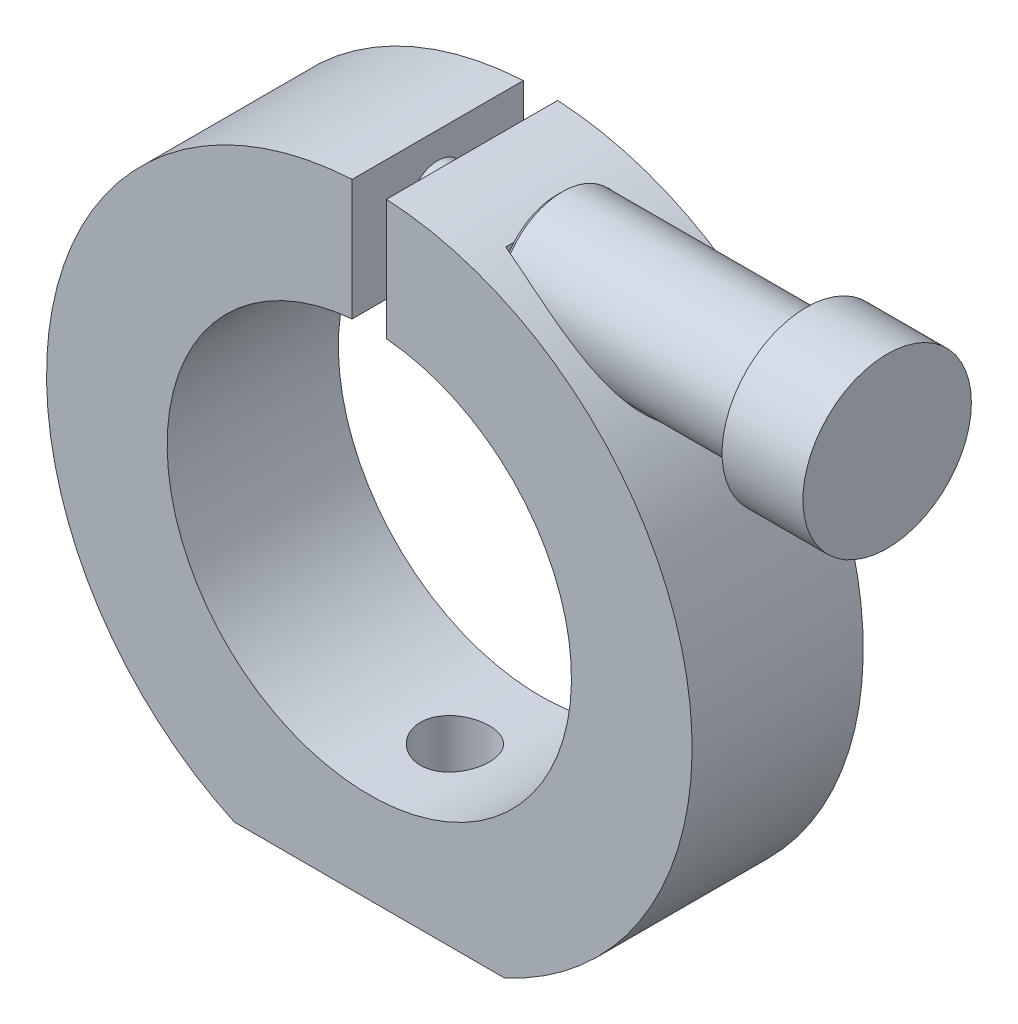
ISO-10303-21;
HEADER;
FILE_DESCRIPTION(('STEP AP214'),'2;1');
FILE_NAME('part.step','',(''),(''),'','','');
FILE_SCHEMA(('AUTOMOTIVE_DESIGN { 1 0 10303 214 1 1 1 1 }'));
ENDSEC;
DATA;
#1=APPLICATION_CONTEXT('core data for automotive mechanical design processes');
#2=APPLICATION_PROTOCOL_DEFINITION('international standard','automotive_design',2000,#1);
#3=PRODUCT_CONTEXT('',#1,'mechanical');
#4=PRODUCT('Part','Part','',(#3));
#5=PRODUCT_RELATED_PRODUCT_CATEGORY('part','',(#4));
#6=PRODUCT_DEFINITION_FORMATION('','',#4);
#7=PRODUCT_DEFINITION_CONTEXT('part definition',#1,'design');
#8=PRODUCT_DEFINITION('design','',#6,#7);
#9=PRODUCT_DEFINITION_SHAPE('','',#8);
#10=(LENGTH_UNIT() NAMED_UNIT(*) SI_UNIT(.MILLI.,.METRE.));
#11=(NAMED_UNIT(*) PLANE_ANGLE_UNIT() SI_UNIT($,.RADIAN.));
#12=(NAMED_UNIT(*) SI_UNIT($,.STERADIAN.) SOLID_ANGLE_UNIT());
#13=UNCERTAINTY_MEASURE_WITH_UNIT(LENGTH_MEASURE(1.E-05),#10,'distance_accuracy_value','');
#14=(GEOMETRIC_REPRESENTATION_CONTEXT(3) GLOBAL_UNCERTAINTY_ASSIGNED_CONTEXT((#13)) GLOBAL_UNIT_ASSIGNED_CONTEXT((#10,
#11,#12)) REPRESENTATION_CONTEXT('',''));
#15=CARTESIAN_POINT('',(0.,0.,0.));
#16=DIRECTION('',(0.,0.,1.));
#17=DIRECTION('',(1.,0.,0.));
#18=AXIS2_PLACEMENT_3D('',#15,#16,#17);
#19=CARTESIAN_POINT('',(12.129998102,29.465143855,-0.0642591750000001));
#20=DIRECTION('',(-1.,0.,0.));
#21=DIRECTION('',(0.,-1.,0.));
#22=AXIS2_PLACEMENT_3D('',#19,#20,#21);
#23=CYLINDRICAL_SURFACE('',#22,2.175);
#24=CARTESIAN_POINT('',(-5.57000189844085,29.465143855,-0.0642591750000001));
#25=DIRECTION('',(-1.,0.,0.));
#26=DIRECTION('',(0.,-1.,0.));
#27=AXIS2_PLACEMENT_3D('',#24,#25,#26);
#28=CIRCLE('',#27,2.175);
#29=CARTESIAN_POINT('',(-5.57000189844085,27.290143855,-0.0642591750000001));
#30=VERTEX_POINT('',#29);
#31=EDGE_CURVE('E135',#30,#30,#28,.T.);
#32=ORIENTED_EDGE('',*,*,#31,.T.);
#33=EDGE_LOOP('',(#32));
#34=FACE_BOUND('',#33,.T.);
#35=CARTESIAN_POINT('',(12.129998101484,29.465143855,-0.0642591750000001));
#36=DIRECTION('',(-1.,0.,0.));
#37=DIRECTION('',(0.,-1.,0.));
#38=AXIS2_PLACEMENT_3D('',#35,#36,#37);
#39=CIRCLE('',#38,2.175);
#40=CARTESIAN_POINT('',(12.129998101484,27.290143855,-0.0642591750000001));
#41=VERTEX_POINT('',#40);
#42=EDGE_CURVE('E138',#41,#41,#39,.F.);
#43=ORIENTED_EDGE('',*,*,#42,.T.);
#44=EDGE_LOOP('',(#43));
#45=FACE_BOUND('',#44,.T.);
#46=ADVANCED_FACE('F18',(#34,#45),#23,.F.);
#47=CARTESIAN_POINT('',(-5.570001898,29.465143855,-0.0642591750000001));
#48=DIRECTION('',(-1.,0.,0.));
#49=DIRECTION('',(0.,0.,1.));
#50=AXIS2_PLACEMENT_3D('',#47,#48,#49);
#51=CONICAL_SURFACE('',#50,2.175,0.785398163397448);
#52=CARTESIAN_POINT('',(-5.97000189800001,29.465143855,-0.0642591750000001));
#53=DIRECTION('',(-1.,0.,0.));
#54=DIRECTION('',(0.,0.,1.));
#55=AXIS2_PLACEMENT_3D('',#52,#53,#54);
#56=CIRCLE('',#55,2.57500000000001);
#57=CARTESIAN_POINT('',(-5.97000189800001,29.465143855,2.51074082500001));
#58=VERTEX_POINT('',#57);
#59=EDGE_CURVE('E141',#58,#58,#56,.T.);
#60=ORIENTED_EDGE('',*,*,#59,.T.);
#61=EDGE_LOOP('',(#60));
#62=FACE_BOUND('',#61,.T.);
#63=ORIENTED_EDGE('',*,*,#31,.F.);
#64=EDGE_LOOP('',(#63));
#65=FACE_BOUND('',#64,.T.);
#66=ADVANCED_FACE('F165',(#62,#65),#51,.F.);
#67=CARTESIAN_POINT('',(12.129998102,29.465143855,-0.0642591750000001));
#68=DIRECTION('',(1.,0.,0.));
#69=DIRECTION('',(0.,1.,0.));
#70=AXIS2_PLACEMENT_3D('',#67,#68,#69);
#71=CONICAL_SURFACE('',#70,2.175,0.785398163397446);
#72=CARTESIAN_POINT('',(12.529998102,29.465143855,-0.0642591750000001));
#73=DIRECTION('',(1.,0.,0.));
#74=DIRECTION('',(0.,1.,0.));
#75=AXIS2_PLACEMENT_3D('',#72,#73,#74);
#76=CIRCLE('',#75,2.57499999999995);
#77=CARTESIAN_POINT('',(12.5299981019999,32.0401438549999,-0.0642591750000001));
#78=VERTEX_POINT('',#77);
#79=EDGE_CURVE('E103',#78,#78,#76,.T.);
#80=ORIENTED_EDGE('',*,*,#79,.T.);
#81=EDGE_LOOP('',(#80));
#82=FACE_BOUND('',#81,.T.);
#83=ORIENTED_EDGE('',*,*,#42,.F.);
#84=EDGE_LOOP('',(#83));
#85=FACE_BOUND('',#84,.T.);
#86=ADVANCED_FACE('F171',(#82,#85),#71,.F.);
#87=CARTESIAN_POINT('',(-12.270001898,29.465143855,-0.0642591750000001));
#88=DIRECTION('',(1.,0.,0.));
#89=DIRECTION('',(0.,0.,-1.));
#90=AXIS2_PLACEMENT_3D('',#87,#88,#89);
#91=CYLINDRICAL_SURFACE('',#90,2.125);
#92=CARTESIAN_POINT('',(-5.97000189851597,29.465143855,-0.0642591750000001));
#93=DIRECTION('',(1.,0.,0.));
#94=DIRECTION('',(0.,0.,-1.));
#95=AXIS2_PLACEMENT_3D('',#92,#93,#94);
#96=CIRCLE('',#95,2.125);
#97=CARTESIAN_POINT('',(-5.97000189851597,29.465143855,-2.189259175));
#98=VERTEX_POINT('',#97);
#99=EDGE_CURVE('E116',#98,#98,#96,.T.);
#100=ORIENTED_EDGE('',*,*,#99,.T.);
#101=EDGE_LOOP('',(#100));
#102=FACE_BOUND('',#101,.T.);
#103=CARTESIAN_POINT('',(-12.270001898516,29.465143855,-0.0642591750000001));
#104=DIRECTION('',(1.,0.,0.));
#105=DIRECTION('',(0.,0.,-1.));
#106=AXIS2_PLACEMENT_3D('',#103,#104,#105);
#107=CIRCLE('',#106,2.125);
#108=CARTESIAN_POINT('',(-12.270001898516,29.465143855,-2.189259175));
#109=VERTEX_POINT('',#108);
#110=EDGE_CURVE('E122',#109,#109,#107,.F.);
#111=ORIENTED_EDGE('',*,*,#110,.T.);
#112=EDGE_LOOP('',(#111));
#113=FACE_BOUND('',#112,.T.);
#114=ADVANCED_FACE('F181',(#102,#113),#91,.F.);
#115=CARTESIAN_POINT('',(-5.970001898,34.165143855,-0.064259175));
#116=DIRECTION('',(-1.,0.,0.));
#117=DIRECTION('',(0.,0.,1.));
#118=AXIS2_PLACEMENT_3D('',#115,#116,#117);
#119=PLANE('',#118);
#120=ORIENTED_EDGE('',*,*,#99,.F.);
#121=EDGE_LOOP('',(#120));
#122=FACE_BOUND('',#121,.T.);
#123=ORIENTED_EDGE('',*,*,#59,.F.);
#124=EDGE_LOOP('',(#123));
#125=FACE_BOUND('',#124,.T.);
#126=ADVANCED_FACE('F212',(#122,#125),#119,.F.);
#127=CARTESIAN_POINT('',(-12.270001898,33.431181884,6.285740825));
#128=DIRECTION('',(1.,0.,0.));
#129=DIRECTION('',(0.,0.,-1.));
#130=AXIS2_PLACEMENT_3D('',#127,#128,#129);
#131=PLANE('',#130);
#132=ORIENTED_EDGE('',*,*,#110,.F.);
#133=EDGE_LOOP('',(#132));
#134=FACE_BOUND('',#133,.T.);
#135=DIRECTION('',(0.,1.,0.));
#136=VECTOR('',#135,1.);
#137=CARTESIAN_POINT('',(-12.270001898,9.515143855,6.285740825));
#138=LINE('',#137,#136);
#139=CARTESIAN_POINT('',(-12.270001898,33.4311818839522,6.285740825));
#140=VERTEX_POINT('',#139);
#141=CARTESIAN_POINT('',(-12.270001898015,24.460858123647,6.285740825));
#142=VERTEX_POINT('',#141);
#143=EDGE_CURVE('E335',#140,#142,#138,.F.);
#144=ORIENTED_EDGE('',*,*,#143,.F.);
#145=DIRECTION('',(0.,0.,-1.));
#146=VECTOR('',#145,1.);
#147=CARTESIAN_POINT('',(-12.270001898,33.431181884,6.285740825));
#148=LINE('',#147,#146);
#149=CARTESIAN_POINT('',(-12.270001898,33.4311818839522,-6.414259175));
#150=VERTEX_POINT('',#149);
#151=EDGE_CURVE('E125',#140,#150,#148,.T.);
#152=ORIENTED_EDGE('',*,*,#151,.T.);
#153=DIRECTION('',(0.,1.,0.));
#154=VECTOR('',#153,1.);
#155=CARTESIAN_POINT('',(-12.270001898,9.515143855,-6.414259175));
#156=LINE('',#155,#154);
#157=CARTESIAN_POINT('',(-12.270001898015,24.460858123647,-6.414259175));
#158=VERTEX_POINT('',#157);
#159=EDGE_CURVE('E338',#158,#150,#156,.T.);
#160=ORIENTED_EDGE('',*,*,#159,.F.);
#161=DIRECTION('',(0.,0.,-1.));
#162=VECTOR('',#161,1.);
#163=CARTESIAN_POINT('',(-12.27000189803,24.4608581236483,6.285740825));
#164=LINE('',#163,#162);
#165=EDGE_CURVE('E230',#142,#158,#164,.T.);
#166=ORIENTED_EDGE('',*,*,#165,.F.);
#167=EDGE_LOOP('',(#144,#152,#160,#166));
#168=FACE_BOUND('',#167,.T.);
#169=ADVANCED_FACE('F208',(#134,#168),#131,.F.);
#170=CARTESIAN_POINT('',(-13.545001898,9.515143855,6.285740825));
#171=DIRECTION('',(0.,0.,-1.));
#172=DIRECTION('',(-1.,0.,0.));
#173=AXIS2_PLACEMENT_3D('',#170,#171,#172);
#174=CYLINDRICAL_SURFACE('',#173,15.);
#175=CARTESIAN_POINT('',(-13.545001898,-5.484856145,2.488440825));
#176=CARTESIAN_POINT('',(-13.6871465246069,-5.4848533762355,2.48843425054818));
#177=CARTESIAN_POINT('',(-13.8294720274502,-5.48281284298392,2.47651767349826));
#178=CARTESIAN_POINT('',(-14.1102357159713,-5.47486375791847,2.42915830945584));
#179=CARTESIAN_POINT('',(-14.2486654373758,-5.46894737409736,2.39366788429897));
#180=CARTESIAN_POINT('',(-14.517375244742,-5.45390999934109,2.30026227037951));
#181=CARTESIAN_POINT('',(-14.6476653713411,-5.44479305224751,2.24237536969335));
#182=CARTESIAN_POINT('',(-14.8966298320807,-5.42435825706781,2.10588669084476));
#183=CARTESIAN_POINT('',(-15.0153084250751,-5.4130412205095,2.02729254699632));
#184=CARTESIAN_POINT('',(-15.2389335856912,-5.38933098896695,1.85077209498865));
#185=CARTESIAN_POINT('',(-15.3437467713865,-5.37692901530232,1.75267795943207));
#186=CARTESIAN_POINT('',(-15.5355156072145,-5.35251310243081,1.54029876651961));
#187=CARTESIAN_POINT('',(-15.6224691804097,-5.3404992084914,1.42601182867225));
#188=CARTESIAN_POINT('',(-15.776573976197,-5.31813661069747,1.18358774324982));
#189=CARTESIAN_POINT('',(-15.8435946295857,-5.30779907985171,1.05536647413837));
#190=CARTESIAN_POINT('',(-15.9550951524479,-5.2900801515601,0.789281526055958));
#191=CARTESIAN_POINT('',(-15.9995768058966,-5.28269852016277,0.651418611210247));
#192=CARTESIAN_POINT('',(-16.0643209420954,-5.27181356369793,0.371362319111017));
#193=CARTESIAN_POINT('',(-16.0848113871749,-5.26827375791088,0.229223087720709));
#194=CARTESIAN_POINT('',(-16.1016983655933,-5.265362951793,-0.0565169482633049));
#195=CARTESIAN_POINT('',(-16.0980966371152,-5.26599165071618,-0.200117646669873));
#196=CARTESIAN_POINT('',(-16.0670871220662,-5.2713135168455,-0.483071605706323));
#197=CARTESIAN_POINT('',(-16.0399361282756,-5.27596283957658,-0.622453953794663));
#198=CARTESIAN_POINT('',(-15.9630016329099,-5.2887334828727,-0.894656854027967));
#199=CARTESIAN_POINT('',(-15.9132171407328,-5.29685495540262,-1.02747711868766));
#200=CARTESIAN_POINT('',(-15.7921681272172,-5.31570223470477,-1.28355435838396));
#201=CARTESIAN_POINT('',(-15.7207967596118,-5.32644094317016,-1.406759837746));
#202=CARTESIAN_POINT('',(-15.5586816307557,-5.34930276552453,-1.6395336549244));
#203=CARTESIAN_POINT('',(-15.4679377293402,-5.36142588942979,-1.74910189406294));
#204=CARTESIAN_POINT('',(-15.2682745194208,-5.38588141755614,-1.95296879791801));
#205=CARTESIAN_POINT('',(-15.1591382727403,-5.39821451962986,-2.04705501706497));
#206=CARTESIAN_POINT('',(-14.9264581924312,-5.42156350794251,-2.21565415086937));
#207=CARTESIAN_POINT('',(-14.8029079602007,-5.4325788047579,-2.29015832463577));
#208=CARTESIAN_POINT('',(-14.5446708390808,-5.45206880433008,-2.41749360793866));
#209=CARTESIAN_POINT('',(-14.4099654130303,-5.46053916540666,-2.47028773588841));
#210=CARTESIAN_POINT('',(-14.1336000727689,-5.47393841309585,-2.55233603002775));
#211=CARTESIAN_POINT('',(-13.9919554871394,-5.47887476008366,-2.58163980059528));
#212=CARTESIAN_POINT('',(-13.7985671698368,-5.48279861831541,-2.60484462081294));
#213=CARTESIAN_POINT('',(-13.747970260778,-5.48356853766727,-2.60938389641412));
#214=CARTESIAN_POINT('',(-13.6465905696808,-5.48459779604648,-2.6154423497752));
#215=CARTESIAN_POINT('',(-13.595807787478,-5.48485713462266,-2.61696152486634));
#216=CARTESIAN_POINT('',(-13.4028572713931,-5.48485337623549,-2.61695260054818));
#217=CARTESIAN_POINT('',(-13.2605317685498,-5.48281284298392,-2.60503602349826));
#218=CARTESIAN_POINT('',(-12.9797680800287,-5.47486375791847,-2.55767665945584));
#219=CARTESIAN_POINT('',(-12.8413383586242,-5.46894737409736,-2.52218623429897));
#220=CARTESIAN_POINT('',(-12.572628551258,-5.45390999934109,-2.42878062037951));
#221=CARTESIAN_POINT('',(-12.4423384246589,-5.44479305224751,-2.37089371969335));
#222=CARTESIAN_POINT('',(-12.1933739639193,-5.42435825706781,-2.23440504084476));
#223=CARTESIAN_POINT('',(-12.0746953709249,-5.4130412205095,-2.15581089699632));
#224=CARTESIAN_POINT('',(-11.8510702103088,-5.38933098896695,-1.97929044498864));
#225=CARTESIAN_POINT('',(-11.7462570246135,-5.37692901530232,-1.88119630943207));
#226=CARTESIAN_POINT('',(-11.5544881887855,-5.35251310243081,-1.66881711651961));
#227=CARTESIAN_POINT('',(-11.4675346155903,-5.3404992084914,-1.55453017867225));
#228=CARTESIAN_POINT('',(-11.313429819803,-5.31813661069747,-1.31210609324982));
#229=CARTESIAN_POINT('',(-11.2464091664143,-5.30779907985171,-1.18388482413836));
#230=CARTESIAN_POINT('',(-11.1349086435521,-5.2900801515601,-0.917799876055955));
#231=CARTESIAN_POINT('',(-11.0904269901034,-5.28269852016277,-0.779936961210244));
#232=CARTESIAN_POINT('',(-11.0256828539046,-5.27181356369793,-0.499880669111013));
#233=CARTESIAN_POINT('',(-11.0051924088251,-5.26827375791088,-0.357741437720705));
#234=CARTESIAN_POINT('',(-10.9883054304067,-5.26536295179301,-0.0720014017366898));
#235=CARTESIAN_POINT('',(-10.9919071588848,-5.26599165071618,0.0715992966698783));
#236=CARTESIAN_POINT('',(-11.0229166739338,-5.2713135168455,0.354553255706329));
#237=CARTESIAN_POINT('',(-11.0500676677244,-5.27596283957658,0.493935603794669));
#238=CARTESIAN_POINT('',(-11.1270021630901,-5.2887334828727,0.766138504027973));
#239=CARTESIAN_POINT('',(-11.1767866552672,-5.29685495540262,0.898958768687665));
#240=CARTESIAN_POINT('',(-11.2978356687828,-5.31570223470478,1.15503600838396));
#241=CARTESIAN_POINT('',(-11.3692070363882,-5.32644094317016,1.27824148774601));
#242=CARTESIAN_POINT('',(-11.5313221652443,-5.34930276552453,1.5110153049244));
#243=CARTESIAN_POINT('',(-11.6220660666598,-5.36142588942979,1.62058354406294));
#244=CARTESIAN_POINT('',(-11.8217292765792,-5.38588141755613,1.82445044791801));
#245=CARTESIAN_POINT('',(-11.9308655232597,-5.39821451962986,1.91853666706498));
#246=CARTESIAN_POINT('',(-12.1635456035688,-5.42156350794251,2.08713580086937));
#247=CARTESIAN_POINT('',(-12.2870958357993,-5.4325788047579,2.16163997463578));
#248=CARTESIAN_POINT('',(-12.5453329569193,-5.45206880433008,2.28897525793867));
#249=CARTESIAN_POINT('',(-12.6800383829697,-5.46053916540666,2.34176938588841));
#250=CARTESIAN_POINT('',(-12.9564037232311,-5.47393841309586,2.42381768002775));
#251=CARTESIAN_POINT('',(-13.0980483088606,-5.47887476008366,2.45312145059528));
#252=CARTESIAN_POINT('',(-13.2914366261632,-5.48279861831541,2.47632627081294));
#253=CARTESIAN_POINT('',(-13.342033535222,-5.48356853766726,2.48086554641412));
#254=CARTESIAN_POINT('',(-13.4434132263192,-5.48459779604648,2.4869239997752));
#255=CARTESIAN_POINT('',(-13.494196008522,-5.48485713462266,2.48844317486633));
#256=CARTESIAN_POINT('',(-13.545001898,-5.484856145,2.488440825));
#257=B_SPLINE_CURVE_WITH_KNOTS('',3,(#175,#176,#177,#178,#179,#180,#181,#182,#183,#184,#185,
#186,#187,#188,#189,#190,#191,#192,#193,#194,#195,#196,#197,#198,#199,#200,#201,#202,#203,#204,
#205,#206,#207,#208,#209,#210,#211,#212,#213,#214,#215,#216,#217,#218,#219,#220,#221,#222,#223,
#224,#225,#226,#227,#228,#229,#230,#231,#232,#233,#234,#235,#236,#237,#238,#239,#240,#241,#242,
#243,#244,#245,#246,#247,#248,#249,#250,#251,#252,#253,#254,#255,#256),.UNSPECIFIED.,.T.,.F.,(4,
2,2,2,2,2,2,2,2,2,2,2,2,2,2,2,2,2,2,2,2,2,2,2,2,2,2,2,2,2,2,2,2,2,2,2,2,2,2,2,4),(0.,
0.4262399222687,0.85334382376056,1.27991001957911,1.70631916917191,2.13657085730245,
2.56687255214526,2.99993378464918,3.43296073474401,3.86183882262125,4.2906859684756,
4.71491472217459,5.13916204491033,5.56554457156986,5.99193018331473,6.42375095602313,
6.85576415564335,7.28851024205021,7.72034007719466,7.87268828593526,8.02503662930084,
8.45127655156954,8.8783804530614,9.30494664887995,9.73135579847275,10.1616074866033,
10.5919091814461,11.02497041395,11.4579973640448,11.8868754519221,12.3157225977764,
12.7399513514754,13.1641986742112,13.5905812008707,14.0169668126156,14.448787585324,
14.8808007849442,15.313546871351,15.7453767064955,15.8977249152361,16.0500732586017),.UNSPECIFIED.);
#258=CARTESIAN_POINT('',(-13.545001898,-5.484856145,2.488440825));
#259=VERTEX_POINT('',#258);
#260=EDGE_CURVE('E313',#259,#259,#257,.T.);
#261=ORIENTED_EDGE('',*,*,#260,.T.);
#262=EDGE_LOOP('',(#261));
#263=FACE_BOUND('',#262,.T.);
#264=CARTESIAN_POINT('',(-13.545001898,9.515143855,-6.414259175));
#265=DIRECTION('',(0.,0.,-1.));
#266=DIRECTION('',(-1.,0.,0.));
#267=AXIS2_PLACEMENT_3D('',#264,#265,#266);
#268=CIRCLE('',#267,15.);
#269=CARTESIAN_POINT('',(-14.820001897985,24.460858123647,-6.414259175));
#270=VERTEX_POINT('',#269);
#271=EDGE_CURVE('E331',#270,#158,#268,.F.);
#272=ORIENTED_EDGE('',*,*,#271,.F.);
#273=DIRECTION('',(0.,0.,-1.));
#274=VECTOR('',#273,1.);
#275=CARTESIAN_POINT('',(-14.82000189797,24.4608581236483,6.285740825));
#276=LINE('',#275,#274);
#277=CARTESIAN_POINT('',(-14.820001897985,24.460858123647,6.285740825));
#278=VERTEX_POINT('',#277);
#279=EDGE_CURVE('E323',#270,#278,#276,.F.);
#280=ORIENTED_EDGE('',*,*,#279,.T.);
#281=CARTESIAN_POINT('',(-13.545001898,9.515143855,6.285740825));
#282=DIRECTION('',(0.,0.,-1.));
#283=DIRECTION('',(-1.,0.,0.));
#284=AXIS2_PLACEMENT_3D('',#281,#282,#283);
#285=CIRCLE('',#284,15.);
#286=EDGE_CURVE('E332',#142,#278,#285,.T.);
#287=ORIENTED_EDGE('',*,*,#286,.F.);
#288=ORIENTED_EDGE('',*,*,#165,.T.);
#289=EDGE_LOOP('',(#272,#280,#287,#288));
#290=FACE_BOUND('',#289,.T.);
#291=ADVANCED_FACE('F211',(#263,#290),#174,.F.);
#292=CARTESIAN_POINT('',(-13.545001898,-5.22421556549061,-0.0642591750000001));
#293=DIRECTION('',(0.,-1.,0.));
#294=DIRECTION('',(0.,0.,-1.));
#295=AXIS2_PLACEMENT_3D('',#292,#293,#294);
#296=CYLINDRICAL_SURFACE('',#295,2.5527);
#297=CARTESIAN_POINT('',(-13.545001898,-12.234856145,-0.0642591750000001));
#298=DIRECTION('',(0.,-1.,0.));
#299=DIRECTION('',(0.,0.,-1.));
#300=AXIS2_PLACEMENT_3D('',#297,#298,#299);
#301=CIRCLE('',#300,2.5527);
#302=CARTESIAN_POINT('',(-13.545001898,-12.234856145,-2.616959175));
#303=VERTEX_POINT('',#302);
#304=EDGE_CURVE('E320',#303,#303,#301,.T.);
#305=ORIENTED_EDGE('',*,*,#304,.T.);
#306=EDGE_LOOP('',(#305));
#307=FACE_BOUND('',#306,.T.);
#308=ORIENTED_EDGE('',*,*,#260,.F.);
#309=EDGE_LOOP('',(#308));
#310=FACE_BOUND('',#309,.T.);
#311=ADVANCED_FACE('F296',(#307,#310),#296,.F.);
#312=CARTESIAN_POINT('',(-13.545001898,9.515143855,-6.414259175));
#313=DIRECTION('',(0.,0.,-1.));
#314=DIRECTION('',(-1.,0.,0.));
#315=AXIS2_PLACEMENT_3D('',#312,#313,#314);
#316=CYLINDRICAL_SURFACE('',#315,23.95);
#317=CARTESIAN_POINT('',(-13.545001898,9.515143855,-6.414259175));
#318=DIRECTION('',(0.,0.,-1.));
#319=DIRECTION('',(-1.,0.,0.));
#320=AXIS2_PLACEMENT_3D('',#317,#318,#319);
#321=CIRCLE('',#320,23.95);
#322=CARTESIAN_POINT('',(-14.820001898,33.4311818839522,-6.414259175));
#323=VERTEX_POINT('',#322);
#324=CARTESIAN_POINT('',(-23.5719655464618,-12.2348561448259,-6.414259175));
#325=VERTEX_POINT('',#324);
#326=EDGE_CURVE('E366',#323,#325,#321,.F.);
#327=ORIENTED_EDGE('',*,*,#326,.T.);
#328=DIRECTION('',(0.,0.,-1.));
#329=VECTOR('',#328,1.);
#330=CARTESIAN_POINT('',(-23.5719655468395,-12.2348561446518,-6.414259175));
#331=LINE('',#330,#329);
#332=CARTESIAN_POINT('',(-23.5719655464618,-12.2348561448259,6.285740825));
#333=VERTEX_POINT('',#332);
#334=EDGE_CURVE('E369',#325,#333,#331,.F.);
#335=ORIENTED_EDGE('',*,*,#334,.T.);
#336=CARTESIAN_POINT('',(-13.545001898,9.515143855,6.285740825));
#337=DIRECTION('',(0.,0.,-1.));
#338=DIRECTION('',(-1.,0.,0.));
#339=AXIS2_PLACEMENT_3D('',#336,#337,#338);
#340=CIRCLE('',#339,23.95);
#341=CARTESIAN_POINT('',(-14.820001898,33.4311818839522,6.285740825));
#342=VERTEX_POINT('',#341);
#343=EDGE_CURVE('E359',#333,#342,#340,.T.);
#344=ORIENTED_EDGE('',*,*,#343,.T.);
#345=DIRECTION('',(0.,0.,1.));
#346=VECTOR('',#345,1.);
#347=CARTESIAN_POINT('',(-14.820001898,33.431181884,6.285740825));
#348=LINE('',#347,#346);
#349=EDGE_CURVE('E371',#323,#342,#348,.T.);
#350=ORIENTED_EDGE('',*,*,#349,.F.);
#351=EDGE_LOOP('',(#327,#335,#344,#350));
#352=FACE_BOUND('',#351,.T.);
#353=ADVANCED_FACE('F292',(#352),#316,.T.);
#354=CARTESIAN_POINT('',(-23.571965547,-12.234856145,6.285740825));
#355=DIRECTION('',(0.,1.,0.));
#356=DIRECTION('',(0.,0.,1.));
#357=AXIS2_PLACEMENT_3D('',#354,#355,#356);
#358=PLANE('',#357);
#359=ORIENTED_EDGE('',*,*,#304,.F.);
#360=EDGE_LOOP('',(#359));
#361=FACE_BOUND('',#360,.T.);
#362=DIRECTION('',(1.,0.,0.));
#363=VECTOR('',#362,1.);
#364=CARTESIAN_POINT('',(-13.545001898,-12.234856145,6.285740825));
#365=LINE('',#364,#363);
#366=CARTESIAN_POINT('',(-3.51803824995057,-12.234856145016,6.285740825));
#367=VERTEX_POINT('',#366);
#368=EDGE_CURVE('E319',#333,#367,#365,.T.);
#369=ORIENTED_EDGE('',*,*,#368,.F.);
#370=ORIENTED_EDGE('',*,*,#334,.F.);
#371=DIRECTION('',(1.,0.,0.));
#372=VECTOR('',#371,1.);
#373=CARTESIAN_POINT('',(-13.545001898,-12.234856145,-6.414259175));
#374=LINE('',#373,#372);
#375=CARTESIAN_POINT('',(-3.51803824995057,-12.234856145016,-6.414259175));
#376=VERTEX_POINT('',#375);
#377=EDGE_CURVE('E362',#376,#325,#374,.F.);
#378=ORIENTED_EDGE('',*,*,#377,.F.);
#379=DIRECTION('',(0.,0.,-1.));
#380=VECTOR('',#379,1.);
#381=CARTESIAN_POINT('',(-3.51803824998526,-12.234856145032,-6.414259175));
#382=LINE('',#381,#380);
#383=EDGE_CURVE('E111',#367,#376,#382,.T.);
#384=ORIENTED_EDGE('',*,*,#383,.F.);
#385=EDGE_LOOP('',(#369,#370,#378,#384));
#386=FACE_BOUND('',#385,.T.);
#387=ADVANCED_FACE('F295',(#361,#386),#358,.F.);
#388=CARTESIAN_POINT('',(-13.545001898,9.515143855,-6.414259175));
#389=DIRECTION('',(0.,0.,1.));
#390=DIRECTION('',(1.,0.,0.));
#391=AXIS2_PLACEMENT_3D('',#388,#389,#390);
#392=PLANE('',#391);
#393=ORIENTED_EDGE('',*,*,#377,.T.);
#394=ORIENTED_EDGE('',*,*,#326,.F.);
#395=DIRECTION('',(0.,1.,0.));
#396=VECTOR('',#395,1.);
#397=CARTESIAN_POINT('',(-14.820001898,9.515143855,-6.414259175));
#398=LINE('',#397,#396);
#399=EDGE_CURVE('E346',#323,#270,#398,.F.);
#400=ORIENTED_EDGE('',*,*,#399,.T.);
#401=ORIENTED_EDGE('',*,*,#271,.T.);
#402=ORIENTED_EDGE('',*,*,#159,.T.);
#403=CARTESIAN_POINT('',(-13.545001898,9.515143855,-6.414259175));
#404=DIRECTION('',(0.,0.,-1.));
#405=DIRECTION('',(-1.,0.,0.));
#406=AXIS2_PLACEMENT_3D('',#403,#404,#405);
#407=CIRCLE('',#406,23.95);
#408=EDGE_CURVE('E341',#150,#376,#407,.T.);
#409=ORIENTED_EDGE('',*,*,#408,.T.);
#410=EDGE_LOOP('',(#393,#394,#400,#401,#402,#409));
#411=FACE_BOUND('',#410,.T.);
#412=ADVANCED_FACE('F300',(#411),#392,.F.);
#413=CARTESIAN_POINT('',(-13.545001898,9.515143855,6.285740825));
#414=DIRECTION('',(0.,0.,1.));
#415=DIRECTION('',(1.,0.,0.));
#416=AXIS2_PLACEMENT_3D('',#413,#414,#415);
#417=PLANE('',#416);
#418=ORIENTED_EDGE('',*,*,#286,.T.);
#419=DIRECTION('',(0.,1.,0.));
#420=VECTOR('',#419,1.);
#421=CARTESIAN_POINT('',(-14.820001898,9.515143855,6.285740825));
#422=LINE('',#421,#420);
#423=EDGE_CURVE('E348',#278,#342,#422,.T.);
#424=ORIENTED_EDGE('',*,*,#423,.T.);
#425=ORIENTED_EDGE('',*,*,#343,.F.);
#426=ORIENTED_EDGE('',*,*,#368,.T.);
#427=CARTESIAN_POINT('',(-13.545001898,9.515143855,6.285740825));
#428=DIRECTION('',(0.,0.,-1.));
#429=DIRECTION('',(-1.,0.,0.));
#430=AXIS2_PLACEMENT_3D('',#427,#428,#429);
#431=CIRCLE('',#430,23.95);
#432=EDGE_CURVE('E355',#367,#140,#431,.F.);
#433=ORIENTED_EDGE('',*,*,#432,.T.);
#434=ORIENTED_EDGE('',*,*,#143,.T.);
#435=EDGE_LOOP('',(#418,#424,#425,#426,#433,#434));
#436=FACE_BOUND('',#435,.T.);
#437=ADVANCED_FACE('F284',(#436),#417,.T.);
#438=CARTESIAN_POINT('',(12.529998102,29.465143855,-0.0642591750000001));
#439=DIRECTION('',(1.,0.,0.));
#440=DIRECTION('',(0.,0.,-1.));
#441=AXIS2_PLACEMENT_3D('',#438,#439,#440);
#442=CYLINDRICAL_SURFACE('',#441,2.);
#443=CARTESIAN_POINT('',(12.529998101484,29.465143855,-0.0642591750000001));
#444=DIRECTION('',(1.,0.,0.));
#445=DIRECTION('',(0.,0.,-1.));
#446=AXIS2_PLACEMENT_3D('',#443,#444,#445);
#447=CIRCLE('',#446,2.);
#448=CARTESIAN_POINT('',(12.529998101484,29.465143855,-2.064259175));
#449=VERTEX_POINT('',#448);
#450=EDGE_CURVE('E377',#449,#449,#447,.F.);
#451=ORIENTED_EDGE('',*,*,#450,.T.);
#452=EDGE_LOOP('',(#451));
#453=FACE_BOUND('',#452,.T.);
#454=CARTESIAN_POINT('',(-14.820001898516,29.465143855,-0.0642591750000001));
#455=DIRECTION('',(1.,0.,0.));
#456=DIRECTION('',(0.,0.,-1.));
#457=AXIS2_PLACEMENT_3D('',#454,#455,#456);
#458=CIRCLE('',#457,2.);
#459=CARTESIAN_POINT('',(-14.820001898516,29.465143855,-2.064259175));
#460=VERTEX_POINT('',#459);
#461=EDGE_CURVE('E374',#460,#460,#458,.T.);
#462=ORIENTED_EDGE('',*,*,#461,.T.);
#463=EDGE_LOOP('',(#462));
#464=FACE_BOUND('',#463,.T.);
#465=ADVANCED_FACE('F280',(#453,#464),#442,.T.);
#466=CARTESIAN_POINT('',(12.529998102,35.715143855,-0.064259175));
#467=DIRECTION('',(-1.,0.,0.));
#468=DIRECTION('',(0.,0.,1.));
#469=AXIS2_PLACEMENT_3D('',#466,#467,#468);
#470=PLANE('',#469);
#471=ORIENTED_EDGE('',*,*,#450,.F.);
#472=EDGE_LOOP('',(#471));
#473=FACE_BOUND('',#472,.T.);
#474=ORIENTED_EDGE('',*,*,#79,.F.);
#475=EDGE_LOOP('',(#474));
#476=FACE_BOUND('',#475,.T.);
#477=ADVANCED_FACE('F283',(#473,#476),#470,.T.);
#478=CARTESIAN_POINT('',(-14.820001898,33.431181884,6.285740825));
#479=DIRECTION('',(-1.,0.,0.));
#480=DIRECTION('',(0.,0.,1.));
#481=AXIS2_PLACEMENT_3D('',#478,#479,#480);
#482=PLANE('',#481);
#483=ORIENTED_EDGE('',*,*,#461,.F.);
#484=EDGE_LOOP('',(#483));
#485=FACE_BOUND('',#484,.T.);
#486=ORIENTED_EDGE('',*,*,#423,.F.);
#487=ORIENTED_EDGE('',*,*,#279,.F.);
#488=ORIENTED_EDGE('',*,*,#399,.F.);
#489=ORIENTED_EDGE('',*,*,#349,.T.);
#490=EDGE_LOOP('',(#486,#487,#488,#489));
#491=FACE_BOUND('',#490,.T.);
#492=ADVANCED_FACE('F163',(#485,#491),#482,.F.);
#493=CARTESIAN_POINT('',(18.529998102,29.465143855,-0.0642591749999998));
#494=DIRECTION('',(1.,0.,0.));
#495=DIRECTION('',(0.,0.,-1.));
#496=AXIS2_PLACEMENT_3D('',#493,#494,#495);
#497=CYLINDRICAL_SURFACE('',#496,6.25);
#498=CARTESIAN_POINT('',(18.529998101484,29.465143855,-0.0642591749999998));
#499=DIRECTION('',(1.,0.,0.));
#500=DIRECTION('',(0.,0.,-1.));
#501=AXIS2_PLACEMENT_3D('',#498,#499,#500);
#502=CIRCLE('',#501,6.25);
#503=CARTESIAN_POINT('',(18.529998101484,29.465143855,-6.314259175));
#504=VERTEX_POINT('',#503);
#505=EDGE_CURVE('E22',#504,#504,#502,.F.);
#506=ORIENTED_EDGE('',*,*,#505,.T.);
#507=EDGE_LOOP('',(#506));
#508=FACE_BOUND('',#507,.T.);
#509=CARTESIAN_POINT('',(12.529998101484,29.465143855,-0.0642591749999998));
#510=DIRECTION('',(1.,0.,0.));
#511=DIRECTION('',(0.,0.,-1.));
#512=AXIS2_PLACEMENT_3D('',#509,#510,#511);
#513=CIRCLE('',#512,6.25);
#514=CARTESIAN_POINT('',(12.529998101484,29.465143855,-6.314259175));
#515=VERTEX_POINT('',#514);
#516=EDGE_CURVE('E104',#515,#515,#513,.F.);
#517=ORIENTED_EDGE('',*,*,#516,.F.);
#518=EDGE_LOOP('',(#517));
#519=FACE_BOUND('',#518,.T.);
#520=ADVANCED_FACE('F151',(#508,#519),#497,.T.);
#521=CARTESIAN_POINT('',(18.529998102,29.465143855,-0.064259175));
#522=DIRECTION('',(1.,0.,0.));
#523=DIRECTION('',(0.,0.,-1.));
#524=AXIS2_PLACEMENT_3D('',#521,#522,#523);
#525=PLANE('',#524);
#526=ORIENTED_EDGE('',*,*,#505,.F.);
#527=EDGE_LOOP('',(#526));
#528=FACE_BOUND('',#527,.T.);
#529=ADVANCED_FACE('F20',(#528),#525,.T.);
#530=CARTESIAN_POINT('',(-5.570001898,29.465143855,-0.0642591749999998));
#531=DIRECTION('',(-1.,0.,0.));
#532=DIRECTION('',(0.,0.,1.));
#533=AXIS2_PLACEMENT_3D('',#530,#531,#532);
#534=CYLINDRICAL_SURFACE('',#533,4.625);
#535=CARTESIAN_POINT('',(-5.57000189851597,29.465143855,-0.0642591749999998));
#536=DIRECTION('',(-1.,0.,0.));
#537=DIRECTION('',(0.,0.,1.));
#538=AXIS2_PLACEMENT_3D('',#535,#536,#537);
#539=CIRCLE('',#538,4.625);
#540=CARTESIAN_POINT('',(-5.57000189851597,29.465143855,4.560740825));
#541=VERTEX_POINT('',#540);
#542=EDGE_CURVE('E128',#541,#541,#539,.F.);
#543=ORIENTED_EDGE('',*,*,#542,.T.);
#544=EDGE_LOOP('',(#543));
#545=FACE_BOUND('',#544,.T.);
#546=CARTESIAN_POINT('',(12.1299981015591,29.465143855,-0.0642591749999998));
#547=DIRECTION('',(-1.,0.,0.));
#548=DIRECTION('',(0.,0.,1.));
#549=AXIS2_PLACEMENT_3D('',#546,#547,#548);
#550=CIRCLE('',#549,4.625);
#551=CARTESIAN_POINT('',(12.1299981015591,29.465143855,4.560740825));
#552=VERTEX_POINT('',#551);
#553=EDGE_CURVE('E100',#552,#552,#550,.T.);
#554=ORIENTED_EDGE('',*,*,#553,.T.);
#555=EDGE_LOOP('',(#554));
#556=FACE_BOUND('',#555,.T.);
#557=ADVANCED_FACE('F155',(#545,#556),#534,.T.);
#558=CARTESIAN_POINT('',(-5.570001898,29.465143855,-0.0642591749999998));
#559=DIRECTION('',(1.,0.,0.));
#560=DIRECTION('',(0.,0.,-1.));
#561=AXIS2_PLACEMENT_3D('',#558,#559,#560);
#562=CONICAL_SURFACE('',#561,4.625,0.785398163397447);
#563=ORIENTED_EDGE('',*,*,#542,.F.);
#564=EDGE_LOOP('',(#563));
#565=FACE_BOUND('',#564,.T.);
#566=CARTESIAN_POINT('',(-5.97000189803254,29.465143855,-0.0642591749999998));
#567=DIRECTION('',(1.,0.,0.));
#568=DIRECTION('',(0.,0.,-1.));
#569=AXIS2_PLACEMENT_3D('',#566,#567,#568);
#570=CIRCLE('',#569,4.22499999996746);
#571=CARTESIAN_POINT('',(-5.97000189801283,32.2356604640999,3.125546887873));
#572=VERTEX_POINT('',#571);
#573=CARTESIAN_POINT('',(-5.97000189801075,32.2356604641713,-3.25406523781372));
#574=VERTEX_POINT('',#573);
#575=EDGE_CURVE('E89',#572,#574,#570,.T.);
#576=ORIENTED_EDGE('',*,*,#575,.T.);
#577=CARTESIAN_POINT('',(-5.9700018980215,29.465143855,-0.0642591749999998));
#578=DIRECTION('',(1.,0.,0.));
#579=DIRECTION('',(0.,0.,-1.));
#580=AXIS2_PLACEMENT_3D('',#577,#578,#579);
#581=CIRCLE('',#580,4.22499999997851);
#582=EDGE_CURVE('E95',#574,#572,#581,.T.);
#583=ORIENTED_EDGE('',*,*,#582,.T.);
#584=EDGE_LOOP('',(#576,#583));
#585=FACE_BOUND('',#584,.T.);
#586=ADVANCED_FACE('F98',(#565,#585),#562,.T.);
#587=CARTESIAN_POINT('',(12.129998102,29.465143855,-0.0642591749999998));
#588=DIRECTION('',(-1.,0.,0.));
#589=DIRECTION('',(0.,-1.,0.));
#590=AXIS2_PLACEMENT_3D('',#587,#588,#589);
#591=CONICAL_SURFACE('',#590,4.625,0.785398163397448);
#592=ORIENTED_EDGE('',*,*,#553,.F.);
#593=EDGE_LOOP('',(#592));
#594=FACE_BOUND('',#593,.T.);
#595=CARTESIAN_POINT('',(12.5299981015217,29.465143855,-0.0642591749999998));
#596=DIRECTION('',(-1.,0.,0.));
#597=DIRECTION('',(0.,-1.,0.));
#598=AXIS2_PLACEMENT_3D('',#595,#596,#597);
#599=CIRCLE('',#598,4.22500000047833);
#600=CARTESIAN_POINT('',(12.5299981015217,25.2401438545217,-0.0642591749999998));
#601=VERTEX_POINT('',#600);
#602=EDGE_CURVE('E96',#601,#601,#599,.T.);
#603=ORIENTED_EDGE('',*,*,#602,.T.);
#604=EDGE_LOOP('',(#603));
#605=FACE_BOUND('',#604,.T.);
#606=ADVANCED_FACE('F176',(#594,#605),#591,.T.);
#607=CARTESIAN_POINT('',(-5.970001898,29.465143855,-0.064259175));
#608=DIRECTION('',(1.,0.,0.));
#609=DIRECTION('',(0.,0.,-1.));
#610=AXIS2_PLACEMENT_3D('',#607,#608,#609);
#611=PLANE('',#610);
#612=ORIENTED_EDGE('',*,*,#582,.F.);
#613=DIRECTION('',(0.,0.,-1.));
#614=VECTOR('',#613,1.);
#615=CARTESIAN_POINT('',(-5.970001898,32.235660464,-0.064259175));
#616=LINE('',#615,#614);
#617=EDGE_CURVE('E82',#574,#572,#616,.F.);
#618=ORIENTED_EDGE('',*,*,#617,.T.);
#619=EDGE_LOOP('',(#612,#618));
#620=FACE_BOUND('',#619,.T.);
#621=ADVANCED_FACE('F102',(#620),#611,.F.);
#622=CARTESIAN_POINT('',(-5.970001898,29.465143855,-0.0642591749999998));
#623=DIRECTION('',(1.,0.,0.));
#624=DIRECTION('',(0.,0.,-1.));
#625=AXIS2_PLACEMENT_3D('',#622,#623,#624);
#626=CYLINDRICAL_SURFACE('',#625,4.7);
#627=CARTESIAN_POINT('',(-5.97000189838234,32.235660464571,3.73234953753426));
#628=CARTESIAN_POINT('',(-5.7283715919769,32.1550948390791,3.79114337560771));
#629=CARTESIAN_POINT('',(-5.48781291657352,32.0706152055507,3.84885860026157));
#630=CARTESIAN_POINT('',(-5.00881386762857,31.8937335202847,3.96102526222642));
#631=CARTESIAN_POINT('',(-4.77037384164034,31.8013301942524,4.01547617216617));
#632=CARTESIAN_POINT('',(-4.05614840350538,31.5112557050054,4.17271990804695));
#633=CARTESIAN_POINT('',(-3.58365946168577,31.3014522583758,4.2688475503505));
#634=CARTESIAN_POINT('',(-2.8741959133395,30.9583003032252,4.39399698649162));
#635=CARTESIAN_POINT('',(-2.63323178005914,30.8367043408085,4.43305912856603));
#636=CARTESIAN_POINT('',(-2.1545740258452,30.5848792307399,4.50227627851128));
#637=CARTESIAN_POINT('',(-1.91687982455387,30.4546516395641,4.53243288692796));
#638=CARTESIAN_POINT('',(-1.44564811744097,30.1859339529483,4.58214787606288));
#639=CARTESIAN_POINT('',(-1.21210370064207,30.0474596812482,4.60172587108498));
#640=CARTESIAN_POINT('',(-0.749388919922272,29.7623317789395,4.62852028902299));
#641=CARTESIAN_POINT('',(-0.520217508587844,29.6156801408194,4.63573970974315));
#642=CARTESIAN_POINT('',(-0.0368842310624658,29.2946326427851,4.63574208870363));
#643=CARTESIAN_POINT('',(0.216558617390389,29.1191374639277,4.62648233401894));
#644=CARTESIAN_POINT('',(0.715492133504564,28.7592449092212,4.58595725248155));
#645=CARTESIAN_POINT('',(0.960979623112975,28.574844047183,4.55468324189363));
#646=CARTESIAN_POINT('',(1.4391726533468,28.2011812739774,4.46661579821698));
#647=CARTESIAN_POINT('',(1.67199079530667,28.0119972314878,4.41011296152498));
#648=CARTESIAN_POINT('',(2.12489198018983,27.6299039119633,4.26741853444903));
#649=CARTESIAN_POINT('',(2.34498922829973,27.4369991240666,4.18126083761867));
#650=CARTESIAN_POINT('',(2.77173286155534,27.0494138219224,3.97345587739305));
#651=CARTESIAN_POINT('',(2.97819304549197,26.8547387473891,3.85140752736557));
#652=CARTESIAN_POINT('',(3.37014713503506,26.4725918682243,3.56771426948637));
#653=CARTESIAN_POINT('',(3.55563749441755,26.2851212854779,3.40606267889394));
#654=CARTESIAN_POINT('',(3.87326954296812,25.9544452748154,3.06813281355634));
#655=CARTESIAN_POINT('',(4.00923157288929,25.8088552461254,2.89787392477831));
#656=CARTESIAN_POINT('',(4.195275117035,25.6053146617691,2.61994227287111));
#657=CARTESIAN_POINT('',(4.2543032873605,25.5399454571715,2.52354782116645));
#658=CARTESIAN_POINT('',(4.36590287428296,25.4151117083911,2.32344362891321));
#659=CARTESIAN_POINT('',(4.41847547836878,25.3556460786439,2.21973523929151));
#660=CARTESIAN_POINT('',(4.50893832870283,25.2524148389869,2.02220344625688));
#661=CARTESIAN_POINT('',(4.54783945802139,25.207647443139,1.9293638895831));
#662=CARTESIAN_POINT('',(4.62032717990627,25.123679814892,1.73920600634375));
#663=CARTESIAN_POINT('',(4.6539146856726,25.0844786260028,1.64188845308634));
#664=CARTESIAN_POINT('',(4.71548464861374,25.0122205845215,1.44326932014768));
#665=CARTESIAN_POINT('',(4.74346694985293,24.9791639028702,1.34196762972232));
#666=CARTESIAN_POINT('',(4.79355332123202,24.9197342065643,1.13604464272651));
#667=CARTESIAN_POINT('',(4.81565973857393,24.8933585232924,1.03142469043139));
#668=CARTESIAN_POINT('',(4.8538746112562,24.8476171526488,0.819083124645422));
#669=CARTESIAN_POINT('',(4.86995610161149,24.8282829906065,0.711349837938518));
#670=CARTESIAN_POINT('',(4.89581031420938,24.7971383536352,0.494096548520554));
#671=CARTESIAN_POINT('',(4.90558566672765,24.7853247419291,0.384577310294016));
#672=CARTESIAN_POINT('',(4.91873465960425,24.7694232350686,0.164587683879367));
#673=CARTESIAN_POINT('',(4.92210781475452,24.7653359254734,0.0541172242376375));
#674=CARTESIAN_POINT('',(4.92241411601613,24.7649650524062,-0.16684202753062));
#675=CARTESIAN_POINT('',(4.9193476143204,24.768681062161,-0.277330818324132));
#676=CARTESIAN_POINT('',(4.90725168578706,24.7833106764937,-0.489642496669413));
#677=CARTESIAN_POINT('',(4.8986578788832,24.7936983902775,-0.591527181668634));
#678=CARTESIAN_POINT('',(4.87601324767237,24.8209929081,-0.793837816698455));
#679=CARTESIAN_POINT('',(4.86196065224232,24.837901827954,-0.894263282298175));
#680=CARTESIAN_POINT('',(4.82852969829028,24.8779728972493,-1.09290870745359));
#681=CARTESIAN_POINT('',(4.8091537791481,24.9011321824142,-1.19112965496978));
#682=CARTESIAN_POINT('',(4.76524526661785,24.9533597226005,-1.38482215094037));
#683=CARTESIAN_POINT('',(4.74071071906609,24.9824302167363,-1.48029264185403));
#684=CARTESIAN_POINT('',(4.65858715661908,25.0791766322301,-1.76543319127819));
#685=CARTESIAN_POINT('',(4.59312523654988,25.1555994714025,-1.9500006651845));
#686=CARTESIAN_POINT('',(4.44363435002141,25.3273028761247,-2.30182710973013));
#687=CARTESIAN_POINT('',(4.35959978393328,25.4225891280638,-2.46908083791837));
#688=CARTESIAN_POINT('',(4.16446731363268,25.6396857152536,-2.80286520235035));
#689=CARTESIAN_POINT('',(4.05135734156049,25.763292699691,-2.96704303564398));
#690=CARTESIAN_POINT('',(3.80790172905266,26.0230482685407,-3.27081448001155));
#691=CARTESIAN_POINT('',(3.67754497986857,26.1592049189722,-3.41039210966391));
#692=CARTESIAN_POINT('',(3.43227600667219,26.408878456777,-3.63795431462061));
#693=CARTESIAN_POINT('',(3.32010512498261,26.5209370489683,-3.73057182658397));
#694=CARTESIAN_POINT('',(3.08812462828797,26.747901288489,-3.90181159458914));
#695=CARTESIAN_POINT('',(2.96831159193122,26.862808196719,-3.98042752161564));
#696=CARTESIAN_POINT('',(2.72193722713814,27.0940458865364,-4.12461626524007));
#697=CARTESIAN_POINT('',(2.59536369523587,27.2103789294435,-4.19016440967493));
#698=CARTESIAN_POINT('',(2.33659986481514,27.4429856640438,-4.30901273492308));
#699=CARTESIAN_POINT('',(2.20440974857537,27.5592593575394,-4.36231331285543));
#700=CARTESIAN_POINT('',(1.88703917038979,27.8321476939279,-4.47472569252356));
#701=CARTESIAN_POINT('',(1.6998055100532,27.9883277128758,-4.52910587251828));
#702=CARTESIAN_POINT('',(1.31796794627854,28.2969160294776,-4.6195977537686));
#703=CARTESIAN_POINT('',(1.12336157532237,28.4493230356428,-4.65570327971056));
#704=CARTESIAN_POINT('',(0.727964154412055,28.7491378726661,-4.71190463225706));
#705=CARTESIAN_POINT('',(0.527169903999884,28.8965430307901,-4.73199202465781));
#706=CARTESIAN_POINT('',(0.120447422341206,29.1854331767341,-4.75816974914694));
#707=CARTESIAN_POINT('',(-0.085482311717416,29.3269163983743,-4.76425593426001));
#708=CARTESIAN_POINT('',(-0.624466157342853,29.6849208719807,-4.7642643276678));
#709=CARTESIAN_POINT('',(-0.960843400570175,29.8964673375133,-4.74889183798616));
#710=CARTESIAN_POINT('',(-1.64224138820374,30.3017787596153,-4.69371699632966));
#711=CARTESIAN_POINT('',(-1.98726676885696,30.4955339070316,-4.6539012595664));
#712=CARTESIAN_POINT('',(-2.68463293323579,30.8648684854112,-4.55506546283177));
#713=CARTESIAN_POINT('',(-3.0369812085469,31.0404280793169,-4.49602472787216));
#714=CARTESIAN_POINT('',(-3.7474533178166,31.372965289848,-4.36335698022729));
#715=CARTESIAN_POINT('',(-4.10557526123229,31.5299488540669,-4.28973465650859));
#716=CARTESIAN_POINT('',(-4.71492840212729,31.7795666274726,-4.15654056520723));
#717=CARTESIAN_POINT('',(-4.96480094846402,31.8770402873818,-4.09970996852063));
#718=CARTESIAN_POINT('',(-5.46607537625113,32.0629732411486,-3.98259033253735));
#719=CARTESIAN_POINT('',(-5.71746925395165,32.1514618379132,-3.92231360808846));
#720=CARTESIAN_POINT('',(-5.97000189779616,32.2356604643756,-3.86086788767687));
#721=B_SPLINE_CURVE_WITH_KNOTS('',3,(#627,#628,#629,#630,#631,#632,#633,#634,#635,#636,#637,
#638,#639,#640,#641,#642,#643,#644,#645,#646,#647,#648,#649,#650,#651,#652,#653,#654,#655,#656,
#657,#658,#659,#660,#661,#662,#663,#664,#665,#666,#667,#668,#669,#670,#671,#672,#673,#674,#675,
#676,#677,#678,#679,#680,#681,#682,#683,#684,#685,#686,#687,#688,#689,#690,#691,#692,#693,#694,
#695,#696,#697,#698,#699,#700,#701,#702,#703,#704,#705,#706,#707,#708,#709,#710,#711,#712,#713,
#714,#715,#716,#717,#718,#719,#720),.UNSPECIFIED.,.F.,.F.,(4,2,2,2,2,2,2,2,2,2,2,2,2,2,2,2,2,2,
2,2,2,2,2,2,2,2,2,2,2,2,2,2,2,2,2,2,2,2,2,2,2,2,2,2,2,2,4),(0.,0.784120284331961,
1.56836690888729,3.14400426224822,3.96192299780839,4.77969464344384,5.59594477134545,
6.41199687438115,7.33633237844476,8.26103270001817,9.17534619577073,10.0886181424671,
11.0125113436105,11.9365605520985,12.719267703682,13.1105729283227,13.5018060649564,
13.8319710316821,14.1620791944305,14.4921965394451,14.8221818157205,15.1536268051011,
15.4849334599985,15.8162652228747,16.1475788652713,16.4555352879862,16.7635917118101,
17.0715072054806,17.3795395528609,18.0073616820697,18.635373357692,19.3365255012561,
20.038131479805,20.5882689573906,21.1386544811905,21.6900694997066,22.2414666364394,
22.9899368087462,23.7386597331651,24.487776631055,25.2371153790654,26.4285388347706,
27.6206152803408,28.8139779688266,30.0069575317644,30.829293955572,31.6488560067923),.UNSPECIFIED.);
#722=CARTESIAN_POINT('',(-5.97000189825799,32.2356604641547,3.73234953783804));
#723=VERTEX_POINT('',#722);
#724=CARTESIAN_POINT('',(-5.97000189825799,32.2356604641215,-3.86086788786233));
#725=VERTEX_POINT('',#724);
#726=EDGE_CURVE('E110',#723,#725,#721,.T.);
#727=ORIENTED_EDGE('',*,*,#726,.T.);
#728=CARTESIAN_POINT('',(-5.97000189851597,29.465143855,-0.0642591749999998));
#729=DIRECTION('',(1.,0.,0.));
#730=DIRECTION('',(0.,0.,-1.));
#731=AXIS2_PLACEMENT_3D('',#728,#729,#730);
#732=CIRCLE('',#731,4.7);
#733=EDGE_CURVE('E114',#725,#723,#732,.F.);
#734=ORIENTED_EDGE('',*,*,#733,.T.);
#735=EDGE_LOOP('',(#727,#734));
#736=FACE_BOUND('',#735,.T.);
#737=ADVANCED_FACE('F185',(#736),#626,.F.);
#738=CARTESIAN_POINT('',(-13.545001898,9.515143855,-6.414259175));
#739=DIRECTION('',(0.,0.,-1.));
#740=DIRECTION('',(-1.,0.,0.));
#741=AXIS2_PLACEMENT_3D('',#738,#739,#740);
#742=CYLINDRICAL_SURFACE('',#741,23.95);
#743=ORIENTED_EDGE('',*,*,#726,.F.);
#744=DIRECTION('',(0.,0.,1.));
#745=VECTOR('',#744,1.);
#746=CARTESIAN_POINT('',(-5.970001898,32.235660464,-0.064259175));
#747=LINE('',#746,#745);
#748=EDGE_CURVE('E92',#572,#723,#747,.T.);
#749=ORIENTED_EDGE('',*,*,#748,.F.);
#750=ORIENTED_EDGE('',*,*,#617,.F.);
#751=DIRECTION('',(0.,0.,1.));
#752=VECTOR('',#751,1.);
#753=CARTESIAN_POINT('',(-5.970001898,32.235660464,-0.064259175));
#754=LINE('',#753,#752);
#755=EDGE_CURVE('E93',#725,#574,#754,.T.);
#756=ORIENTED_EDGE('',*,*,#755,.F.);
#757=EDGE_LOOP('',(#743,#749,#750,#756));
#758=FACE_BOUND('',#757,.T.);
#759=ORIENTED_EDGE('',*,*,#432,.F.);
#760=ORIENTED_EDGE('',*,*,#383,.T.);
#761=ORIENTED_EDGE('',*,*,#408,.F.);
#762=ORIENTED_EDGE('',*,*,#151,.F.);
#763=EDGE_LOOP('',(#759,#760,#761,#762));
#764=FACE_BOUND('',#763,.T.);
#765=ADVANCED_FACE('F107',(#758,#764),#742,.T.);
#766=CARTESIAN_POINT('',(-5.970001898,34.165143855,-0.064259175));
#767=DIRECTION('',(-1.,0.,0.));
#768=DIRECTION('',(0.,0.,1.));
#769=AXIS2_PLACEMENT_3D('',#766,#767,#768);
#770=PLANE('',#769);
#771=ORIENTED_EDGE('',*,*,#733,.F.);
#772=ORIENTED_EDGE('',*,*,#755,.T.);
#773=ORIENTED_EDGE('',*,*,#575,.F.);
#774=ORIENTED_EDGE('',*,*,#748,.T.);
#775=EDGE_LOOP('',(#771,#772,#773,#774));
#776=FACE_BOUND('',#775,.T.);
#777=ADVANCED_FACE('F91',(#776),#770,.F.);
#778=CARTESIAN_POINT('',(12.529998102,35.715143855,-0.064259175));
#779=DIRECTION('',(-1.,0.,0.));
#780=DIRECTION('',(0.,0.,1.));
#781=AXIS2_PLACEMENT_3D('',#778,#779,#780);
#782=PLANE('',#781);
#783=ORIENTED_EDGE('',*,*,#602,.F.);
#784=EDGE_LOOP('',(#783));
#785=FACE_BOUND('',#784,.T.);
#786=ORIENTED_EDGE('',*,*,#516,.T.);
#787=EDGE_LOOP('',(#786));
#788=FACE_BOUND('',#787,.T.);
#789=ADVANCED_FACE('F186',(#785,#788),#782,.T.);
#790=CLOSED_SHELL('',(#46,#66,#86,#114,#126,#169,#291,#311,#353,#387,#412,#437,#465,#477,#492,
#520,#529,#557,#586,#606,#621,#737,#765,#777,#789));
#791=CARTESIAN_POINT('',(-22.35780836,29.465143855,-0.064259175));
#792=DIRECTION('',(1.,0.,0.));
#793=DIRECTION('',(0.,0.,-1.));
#794=AXIS2_PLACEMENT_3D('',#791,#792,#793);
#795=CONICAL_SURFACE('',#794,0.,1.0297442583297);
#796=CARTESIAN_POINT('',(-22.35780836,29.465143855,-0.0642591750000002));
#797=VERTEX_POINT('',#796);
#798=VERTEX_LOOP('',#797);
#799=FACE_BOUND('',#798,.T.);
#800=CARTESIAN_POINT('',(-21.3200018979092,29.465143855,-0.064259175));
#801=DIRECTION('',(1.,0.,0.));
#802=DIRECTION('',(0.,0.,-1.));
#803=AXIS2_PLACEMENT_3D('',#800,#801,#802);
#804=CIRCLE('',#803,1.72720000015117);
#805=CARTESIAN_POINT('',(-21.3200018979092,29.465143855,-1.79145917515117));
#806=VERTEX_POINT('',#805);
#807=EDGE_CURVE('E11',#806,#806,#804,.T.);
#808=ORIENTED_EDGE('',*,*,#807,.T.);
#809=EDGE_LOOP('',(#808));
#810=FACE_BOUND('',#809,.T.);
#811=ADVANCED_FACE('F256',(#799,#810),#795,.F.);
#812=CARTESIAN_POINT('',(-21.320001898,29.465143855,-0.0642591750000001));
#813=DIRECTION('',(1.,0.,0.));
#814=DIRECTION('',(0.,0.,-1.));
#815=AXIS2_PLACEMENT_3D('',#812,#813,#814);
#816=CYLINDRICAL_SURFACE('',#815,1.7272);
#817=CARTESIAN_POINT('',(-19.2200018984409,29.465143855,-0.0642591750000001));
#818=DIRECTION('',(1.,0.,0.));
#819=DIRECTION('',(0.,0.,-1.));
#820=AXIS2_PLACEMENT_3D('',#817,#818,#819);
#821=CIRCLE('',#820,1.7272);
#822=CARTESIAN_POINT('',(-19.2200018984409,29.465143855,-1.791459175));
#823=VERTEX_POINT('',#822);
#824=EDGE_CURVE('E29',#823,#823,#821,.T.);
#825=ORIENTED_EDGE('',*,*,#824,.T.);
#826=EDGE_LOOP('',(#825));
#827=FACE_BOUND('',#826,.T.);
#828=ORIENTED_EDGE('',*,*,#807,.F.);
#829=EDGE_LOOP('',(#828));
#830=FACE_BOUND('',#829,.T.);
#831=ADVANCED_FACE('F260',(#827,#830),#816,.F.);
#832=CARTESIAN_POINT('',(-19.220001898,31.465143855,-0.064259175));
#833=DIRECTION('',(-1.,0.,0.));
#834=DIRECTION('',(0.,0.,1.));
#835=AXIS2_PLACEMENT_3D('',#832,#833,#834);
#836=PLANE('',#835);
#837=ORIENTED_EDGE('',*,*,#824,.F.);
#838=EDGE_LOOP('',(#837));
#839=FACE_BOUND('',#838,.T.);
#840=ADVANCED_FACE('F268',(#839),#836,.T.);
#841=CLOSED_SHELL('',(#811,#831,#840));
#842=ORIENTED_CLOSED_SHELL('',*,#841,.T.);
#843=BREP_WITH_VOIDS('B1',#790,(#842));
#844=ADVANCED_BREP_SHAPE_REPRESENTATION('',(#18,#843),#14);
#845=SHAPE_DEFINITION_REPRESENTATION(#9,#844);
ENDSEC;
END-ISO-10303-21;
